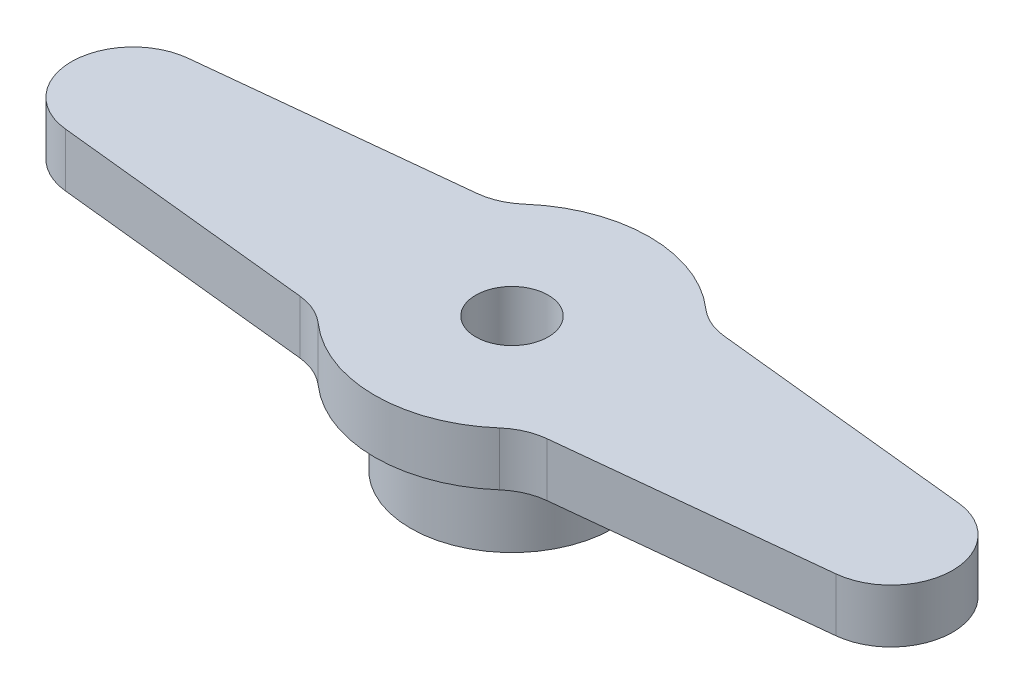
ISO-10303-21;
HEADER;
FILE_DESCRIPTION(('STEP AP214'),'2;1');
FILE_NAME('part.step','',(''),(''),'','','');
FILE_SCHEMA(('AUTOMOTIVE_DESIGN { 1 0 10303 214 1 1 1 1 }'));
ENDSEC;
DATA;
#1=APPLICATION_CONTEXT('core data for automotive mechanical design processes');
#2=APPLICATION_PROTOCOL_DEFINITION('international standard','automotive_design',2000,#1);
#3=PRODUCT_CONTEXT('',#1,'mechanical');
#4=PRODUCT('Part','Part','',(#3));
#5=PRODUCT_RELATED_PRODUCT_CATEGORY('part','',(#4));
#6=PRODUCT_DEFINITION_FORMATION('','',#4);
#7=PRODUCT_DEFINITION_CONTEXT('part definition',#1,'design');
#8=PRODUCT_DEFINITION('design','',#6,#7);
#9=PRODUCT_DEFINITION_SHAPE('','',#8);
#10=(LENGTH_UNIT() NAMED_UNIT(*) SI_UNIT(.MILLI.,.METRE.));
#11=(NAMED_UNIT(*) PLANE_ANGLE_UNIT() SI_UNIT($,.RADIAN.));
#12=(NAMED_UNIT(*) SI_UNIT($,.STERADIAN.) SOLID_ANGLE_UNIT());
#13=UNCERTAINTY_MEASURE_WITH_UNIT(LENGTH_MEASURE(1.E-05),#10,'distance_accuracy_value','');
#14=(GEOMETRIC_REPRESENTATION_CONTEXT(3) GLOBAL_UNCERTAINTY_ASSIGNED_CONTEXT((#13)) GLOBAL_UNIT_ASSIGNED_CONTEXT((#10,
#11,#12)) REPRESENTATION_CONTEXT('',''));
#15=CARTESIAN_POINT('',(0.,0.,0.));
#16=DIRECTION('',(0.,0.,1.));
#17=DIRECTION('',(1.,0.,0.));
#18=AXIS2_PLACEMENT_3D('',#15,#16,#17);
#19=CARTESIAN_POINT('',(0.,0.,0.));
#20=DIRECTION('',(0.,1.,0.));
#21=DIRECTION('',(0.,0.,1.));
#22=AXIS2_PLACEMENT_3D('',#19,#20,#21);
#23=PLANE('',#22);
#24=CARTESIAN_POINT('',(0.,0.,0.));
#25=DIRECTION('',(0.,1.,0.));
#26=DIRECTION('',(0.,0.,1.));
#27=AXIS2_PLACEMENT_3D('',#24,#25,#26);
#28=CIRCLE('',#27,4.3688);
#29=CARTESIAN_POINT('',(0.,0.,4.3688));
#30=VERTEX_POINT('',#29);
#31=EDGE_CURVE('E47',#30,#30,#28,.T.);
#32=ORIENTED_EDGE('',*,*,#31,.F.);
#33=EDGE_LOOP('',(#32));
#34=FACE_BOUND('',#33,.T.);
#35=CARTESIAN_POINT('',(0.,0.,0.));
#36=DIRECTION('',(0.,1.,0.));
#37=DIRECTION('',(0.,0.,1.));
#38=AXIS2_PLACEMENT_3D('',#35,#36,#37);
#39=CIRCLE('',#38,3.048);
#40=CARTESIAN_POINT('',(0.,0.,3.048));
#41=VERTEX_POINT('',#40);
#42=EDGE_CURVE('E247',#41,#41,#39,.T.);
#43=ORIENTED_EDGE('',*,*,#42,.T.);
#44=EDGE_LOOP('',(#43));
#45=FACE_BOUND('',#44,.T.);
#46=ADVANCED_FACE('F43',(#34,#45),#23,.F.);
#47=CARTESIAN_POINT('',(0.,3.429,0.));
#48=DIRECTION('',(0.,-1.,0.));
#49=DIRECTION('',(0.,0.,-1.));
#50=AXIS2_PLACEMENT_3D('',#47,#48,#49);
#51=CYLINDRICAL_SURFACE('',#50,4.3688);
#52=CARTESIAN_POINT('',(0.,3.429,0.));
#53=DIRECTION('',(0.,1.,0.));
#54=DIRECTION('',(0.,0.,1.));
#55=AXIS2_PLACEMENT_3D('',#52,#53,#54);
#56=CIRCLE('',#55,4.3688);
#57=CARTESIAN_POINT('',(0.,3.429,4.3688));
#58=VERTEX_POINT('',#57);
#59=EDGE_CURVE('E11',#58,#58,#56,.T.);
#60=ORIENTED_EDGE('',*,*,#59,.F.);
#61=EDGE_LOOP('',(#60));
#62=FACE_BOUND('',#61,.T.);
#63=ORIENTED_EDGE('',*,*,#31,.T.);
#64=EDGE_LOOP('',(#63));
#65=FACE_BOUND('',#64,.T.);
#66=ADVANCED_FACE('F45',(#62,#65),#51,.T.);
#67=CARTESIAN_POINT('',(0.,3.429,0.));
#68=DIRECTION('',(0.,-1.,0.));
#69=DIRECTION('',(0.,0.,-1.));
#70=AXIS2_PLACEMENT_3D('',#67,#68,#69);
#71=CYLINDRICAL_SURFACE('',#70,3.048);
#72=CARTESIAN_POINT('',(0.,3.429,0.));
#73=DIRECTION('',(0.,1.,0.));
#74=DIRECTION('',(0.,0.,1.));
#75=AXIS2_PLACEMENT_3D('',#72,#73,#74);
#76=CIRCLE('',#75,3.048);
#77=CARTESIAN_POINT('',(0.,3.429,3.048));
#78=VERTEX_POINT('',#77);
#79=EDGE_CURVE('E243',#78,#78,#76,.T.);
#80=ORIENTED_EDGE('',*,*,#79,.T.);
#81=EDGE_LOOP('',(#80));
#82=FACE_BOUND('',#81,.T.);
#83=ORIENTED_EDGE('',*,*,#42,.F.);
#84=EDGE_LOOP('',(#83));
#85=FACE_BOUND('',#84,.T.);
#86=ADVANCED_FACE('F261',(#82,#85),#71,.F.);
#87=CARTESIAN_POINT('',(16.3304426845668,3.429,0.));
#88=DIRECTION('',(0.,-1.,0.));
#89=DIRECTION('',(0.,0.,-1.));
#90=AXIS2_PLACEMENT_3D('',#87,#88,#89);
#91=PLANE('',#90);
#92=CARTESIAN_POINT('',(0.,3.429,0.));
#93=DIRECTION('',(0.,-1.,0.));
#94=DIRECTION('',(0.,0.,-1.));
#95=AXIS2_PLACEMENT_3D('',#92,#93,#94);
#96=CIRCLE('',#95,1.5621);
#97=CARTESIAN_POINT('',(0.,3.429,1.5621));
#98=VERTEX_POINT('',#97);
#99=EDGE_CURVE('E175',#98,#98,#96,.T.);
#100=ORIENTED_EDGE('',*,*,#99,.F.);
#101=EDGE_LOOP('',(#100));
#102=FACE_BOUND('',#101,.T.);
#103=ORIENTED_EDGE('',*,*,#79,.F.);
#104=EDGE_LOOP('',(#103));
#105=FACE_BOUND('',#104,.T.);
#106=ADVANCED_FACE('F266',(#102,#105),#91,.T.);
#107=CARTESIAN_POINT('',(16.3304426845668,5.7404,0.));
#108=DIRECTION('',(0.,-1.,0.));
#109=DIRECTION('',(0.,0.,-1.));
#110=AXIS2_PLACEMENT_3D('',#107,#108,#109);
#111=CYLINDRICAL_SURFACE('',#110,2.65605731543173);
#112=CARTESIAN_POINT('',(16.3304426845668,3.429,0.));
#113=DIRECTION('',(0.,1.,0.));
#114=DIRECTION('',(0.,0.,-1.));
#115=AXIS2_PLACEMENT_3D('',#112,#113,#114);
#116=CIRCLE('',#115,2.65605731543173);
#117=CARTESIAN_POINT('',(16.6071914927998,3.429,2.6416));
#118=VERTEX_POINT('',#117);
#119=CARTESIAN_POINT('',(16.6071914927998,3.429,-2.6416));
#120=VERTEX_POINT('',#119);
#121=EDGE_CURVE('E170',#118,#120,#116,.T.);
#122=ORIENTED_EDGE('',*,*,#121,.T.);
#123=DIRECTION('',(0.,-1.,0.));
#124=VECTOR('',#123,1.);
#125=CARTESIAN_POINT('',(16.6071914927998,5.7404,-2.6416));
#126=LINE('',#125,#124);
#127=CARTESIAN_POINT('',(16.6071914927998,5.7404,-2.6416));
#128=VERTEX_POINT('',#127);
#129=EDGE_CURVE('E240',#128,#120,#126,.T.);
#130=ORIENTED_EDGE('',*,*,#129,.F.);
#131=CARTESIAN_POINT('',(16.3304426845668,5.7404,0.));
#132=DIRECTION('',(0.,1.,0.));
#133=DIRECTION('',(0.,0.,-1.));
#134=AXIS2_PLACEMENT_3D('',#131,#132,#133);
#135=CIRCLE('',#134,2.65605731543173);
#136=CARTESIAN_POINT('',(16.6071914927998,5.7404,2.6416));
#137=VERTEX_POINT('',#136);
#138=EDGE_CURVE('E205',#137,#128,#135,.T.);
#139=ORIENTED_EDGE('',*,*,#138,.F.);
#140=DIRECTION('',(0.,-1.,0.));
#141=VECTOR('',#140,1.);
#142=CARTESIAN_POINT('',(16.6071914927998,5.7404,2.6416));
#143=LINE('',#142,#141);
#144=EDGE_CURVE('E166',#137,#118,#143,.T.);
#145=ORIENTED_EDGE('',*,*,#144,.T.);
#146=EDGE_LOOP('',(#122,#130,#139,#145));
#147=FACE_BOUND('',#146,.T.);
#148=ADVANCED_FACE('F268',(#147),#111,.T.);
#149=CARTESIAN_POINT('',(5.32270878770068,5.7404,-3.82382559818391));
#150=DIRECTION('',(-0.104195344966817,0.,0.994556851108697));
#151=DIRECTION('',(0.994556851108697,0.,0.104195344966817));
#152=AXIS2_PLACEMENT_3D('',#149,#150,#151);
#153=PLANE('',#152);
#154=DIRECTION('',(-0.994556851108697,0.,-0.104195344966817));
#155=VECTOR('',#154,1.);
#156=CARTESIAN_POINT('',(5.32270878770068,3.429,-3.82382559818391));
#157=LINE('',#156,#155);
#158=CARTESIAN_POINT('',(5.32270878770068,3.429,-3.82382559818391));
#159=VERTEX_POINT('',#158);
#160=EDGE_CURVE('E174',#120,#159,#157,.T.);
#161=ORIENTED_EDGE('',*,*,#160,.T.);
#162=DIRECTION('',(0.,-1.,0.));
#163=VECTOR('',#162,1.);
#164=CARTESIAN_POINT('',(5.32270878770068,5.7404,-3.82382559818391));
#165=LINE('',#164,#163);
#166=CARTESIAN_POINT('',(5.32270878770068,5.7404,-3.82382559818391));
#167=VERTEX_POINT('',#166);
#168=EDGE_CURVE('E236',#167,#159,#165,.T.);
#169=ORIENTED_EDGE('',*,*,#168,.F.);
#170=DIRECTION('',(-0.994556851108697,0.,-0.104195344966817));
#171=VECTOR('',#170,1.);
#172=CARTESIAN_POINT('',(5.32270878770068,5.7404,-3.82382559818391));
#173=LINE('',#172,#171);
#174=EDGE_CURVE('E117',#128,#167,#173,.T.);
#175=ORIENTED_EDGE('',*,*,#174,.F.);
#176=ORIENTED_EDGE('',*,*,#129,.T.);
#177=EDGE_LOOP('',(#161,#169,#175,#176));
#178=FACE_BOUND('',#177,.T.);
#179=ADVANCED_FACE('F271',(#178),#153,.F.);
#180=CARTESIAN_POINT('',(5.58736496391636,5.7404,-6.35));
#181=DIRECTION('',(0.,-1.,0.));
#182=DIRECTION('',(0.,0.,-1.));
#183=AXIS2_PLACEMENT_3D('',#180,#181,#182);
#184=CYLINDRICAL_SURFACE('',#183,2.54);
#185=CARTESIAN_POINT('',(5.58736496391636,3.429,-6.35));
#186=DIRECTION('',(0.,-1.,0.));
#187=DIRECTION('',(0.,0.,-1.));
#188=AXIS2_PLACEMENT_3D('',#185,#186,#187);
#189=CIRCLE('',#188,2.54);
#190=CARTESIAN_POINT('',(3.9094775873649,3.429,-4.44309309309309));
#191=VERTEX_POINT('',#190);
#192=EDGE_CURVE('E178',#159,#191,#189,.T.);
#193=ORIENTED_EDGE('',*,*,#192,.T.);
#194=DIRECTION('',(0.,-1.,0.));
#195=VECTOR('',#194,1.);
#196=CARTESIAN_POINT('',(3.9094775873649,5.7404,-4.44309309309309));
#197=LINE('',#196,#195);
#198=CARTESIAN_POINT('',(3.9094775873649,5.7404,-4.44309309309309));
#199=VERTEX_POINT('',#198);
#200=EDGE_CURVE('E232',#199,#191,#197,.T.);
#201=ORIENTED_EDGE('',*,*,#200,.F.);
#202=CARTESIAN_POINT('',(5.58736496391636,5.7404,-6.35));
#203=DIRECTION('',(0.,-1.,0.));
#204=DIRECTION('',(0.,0.,-1.));
#205=AXIS2_PLACEMENT_3D('',#202,#203,#204);
#206=CIRCLE('',#205,2.54);
#207=EDGE_CURVE('E337',#167,#199,#206,.T.);
#208=ORIENTED_EDGE('',*,*,#207,.F.);
#209=ORIENTED_EDGE('',*,*,#168,.T.);
#210=EDGE_LOOP('',(#193,#201,#208,#209));
#211=FACE_BOUND('',#210,.T.);
#212=ADVANCED_FACE('F275',(#211),#184,.F.);
#213=CARTESIAN_POINT('',(0.,5.7404,0.));
#214=DIRECTION('',(0.,-1.,0.));
#215=DIRECTION('',(0.,0.,-1.));
#216=AXIS2_PLACEMENT_3D('',#213,#214,#215);
#217=CYLINDRICAL_SURFACE('',#216,5.9182);
#218=CARTESIAN_POINT('',(0.,3.429,0.));
#219=DIRECTION('',(0.,1.,0.));
#220=DIRECTION('',(0.,0.,1.));
#221=AXIS2_PLACEMENT_3D('',#218,#219,#220);
#222=CIRCLE('',#221,5.9182);
#223=CARTESIAN_POINT('',(-3.9094775873649,3.429,-4.44309309309309));
#224=VERTEX_POINT('',#223);
#225=EDGE_CURVE('E181',#191,#224,#222,.T.);
#226=ORIENTED_EDGE('',*,*,#225,.T.);
#227=DIRECTION('',(0.,-1.,0.));
#228=VECTOR('',#227,1.);
#229=CARTESIAN_POINT('',(-3.9094775873649,5.7404,-4.44309309309309));
#230=LINE('',#229,#228);
#231=CARTESIAN_POINT('',(-3.9094775873649,5.7404,-4.44309309309309));
#232=VERTEX_POINT('',#231);
#233=EDGE_CURVE('E228',#232,#224,#230,.T.);
#234=ORIENTED_EDGE('',*,*,#233,.F.);
#235=CARTESIAN_POINT('',(0.,5.7404,0.));
#236=DIRECTION('',(0.,1.,0.));
#237=DIRECTION('',(0.,0.,1.));
#238=AXIS2_PLACEMENT_3D('',#235,#236,#237);
#239=CIRCLE('',#238,5.9182);
#240=EDGE_CURVE('E340',#199,#232,#239,.T.);
#241=ORIENTED_EDGE('',*,*,#240,.F.);
#242=ORIENTED_EDGE('',*,*,#200,.T.);
#243=EDGE_LOOP('',(#226,#234,#241,#242));
#244=FACE_BOUND('',#243,.T.);
#245=ADVANCED_FACE('F278',(#244),#217,.T.);
#246=CARTESIAN_POINT('',(-5.58736496391636,5.7404,-6.35));
#247=DIRECTION('',(0.,-1.,0.));
#248=DIRECTION('',(0.,0.,-1.));
#249=AXIS2_PLACEMENT_3D('',#246,#247,#248);
#250=CYLINDRICAL_SURFACE('',#249,2.54);
#251=CARTESIAN_POINT('',(-5.58736496391636,3.429,-6.35));
#252=DIRECTION('',(0.,-1.,0.));
#253=DIRECTION('',(0.,0.,1.));
#254=AXIS2_PLACEMENT_3D('',#251,#252,#253);
#255=CIRCLE('',#254,2.54);
#256=CARTESIAN_POINT('',(-5.32270878770068,3.429,-3.82382559818391));
#257=VERTEX_POINT('',#256);
#258=EDGE_CURVE('E184',#224,#257,#255,.T.);
#259=ORIENTED_EDGE('',*,*,#258,.T.);
#260=DIRECTION('',(0.,-1.,0.));
#261=VECTOR('',#260,1.);
#262=CARTESIAN_POINT('',(-5.32270878770068,5.7404,-3.82382559818391));
#263=LINE('',#262,#261);
#264=CARTESIAN_POINT('',(-5.32270878770068,5.7404,-3.82382559818391));
#265=VERTEX_POINT('',#264);
#266=EDGE_CURVE('E224',#265,#257,#263,.T.);
#267=ORIENTED_EDGE('',*,*,#266,.F.);
#268=CARTESIAN_POINT('',(-5.58736496391636,5.7404,-6.35));
#269=DIRECTION('',(0.,-1.,0.));
#270=DIRECTION('',(0.,0.,1.));
#271=AXIS2_PLACEMENT_3D('',#268,#269,#270);
#272=CIRCLE('',#271,2.54);
#273=EDGE_CURVE('E343',#232,#265,#272,.T.);
#274=ORIENTED_EDGE('',*,*,#273,.F.);
#275=ORIENTED_EDGE('',*,*,#233,.T.);
#276=EDGE_LOOP('',(#259,#267,#274,#275));
#277=FACE_BOUND('',#276,.T.);
#278=ADVANCED_FACE('F282',(#277),#250,.F.);
#279=CARTESIAN_POINT('',(-5.32270878770068,5.7404,-3.82382559818391));
#280=DIRECTION('',(0.104195344966817,0.,0.994556851108697));
#281=DIRECTION('',(0.994556851108697,0.,-0.104195344966817));
#282=AXIS2_PLACEMENT_3D('',#279,#280,#281);
#283=PLANE('',#282);
#284=DIRECTION('',(-0.994556851108697,0.,0.104195344966817));
#285=VECTOR('',#284,1.);
#286=CARTESIAN_POINT('',(-5.32270878770068,3.429,-3.82382559818391));
#287=LINE('',#286,#285);
#288=CARTESIAN_POINT('',(-16.6071914927998,3.429,-2.6416));
#289=VERTEX_POINT('',#288);
#290=EDGE_CURVE('E187',#257,#289,#287,.T.);
#291=ORIENTED_EDGE('',*,*,#290,.T.);
#292=DIRECTION('',(0.,-1.,0.));
#293=VECTOR('',#292,1.);
#294=CARTESIAN_POINT('',(-16.6071914927998,5.7404,-2.6416));
#295=LINE('',#294,#293);
#296=CARTESIAN_POINT('',(-16.6071914927998,5.7404,-2.6416));
#297=VERTEX_POINT('',#296);
#298=EDGE_CURVE('E220',#297,#289,#295,.T.);
#299=ORIENTED_EDGE('',*,*,#298,.F.);
#300=DIRECTION('',(-0.994556851108697,0.,0.104195344966817));
#301=VECTOR('',#300,1.);
#302=CARTESIAN_POINT('',(-5.32270878770068,5.7404,-3.82382559818391));
#303=LINE('',#302,#301);
#304=EDGE_CURVE('E346',#265,#297,#303,.T.);
#305=ORIENTED_EDGE('',*,*,#304,.F.);
#306=ORIENTED_EDGE('',*,*,#266,.T.);
#307=EDGE_LOOP('',(#291,#299,#305,#306));
#308=FACE_BOUND('',#307,.T.);
#309=ADVANCED_FACE('F286',(#308),#283,.F.);
#310=CARTESIAN_POINT('',(-16.3304426845668,5.7404,0.));
#311=DIRECTION('',(0.,-1.,0.));
#312=DIRECTION('',(0.,0.,-1.));
#313=AXIS2_PLACEMENT_3D('',#310,#311,#312);
#314=CYLINDRICAL_SURFACE('',#313,2.65605731543173);
#315=CARTESIAN_POINT('',(-16.3304426845668,3.429,0.));
#316=DIRECTION('',(0.,1.,0.));
#317=DIRECTION('',(0.,0.,1.));
#318=AXIS2_PLACEMENT_3D('',#315,#316,#317);
#319=CIRCLE('',#318,2.65605731543173);
#320=CARTESIAN_POINT('',(-16.6071914927998,3.429,2.6416));
#321=VERTEX_POINT('',#320);
#322=EDGE_CURVE('E190',#289,#321,#319,.T.);
#323=ORIENTED_EDGE('',*,*,#322,.T.);
#324=DIRECTION('',(0.,-1.,0.));
#325=VECTOR('',#324,1.);
#326=CARTESIAN_POINT('',(-16.6071914927998,5.7404,2.6416));
#327=LINE('',#326,#325);
#328=CARTESIAN_POINT('',(-16.6071914927998,5.7404,2.6416));
#329=VERTEX_POINT('',#328);
#330=EDGE_CURVE('E216',#329,#321,#327,.T.);
#331=ORIENTED_EDGE('',*,*,#330,.F.);
#332=CARTESIAN_POINT('',(-16.3304426845668,5.7404,0.));
#333=DIRECTION('',(0.,1.,0.));
#334=DIRECTION('',(0.,0.,1.));
#335=AXIS2_PLACEMENT_3D('',#332,#333,#334);
#336=CIRCLE('',#335,2.65605731543173);
#337=EDGE_CURVE('E349',#297,#329,#336,.T.);
#338=ORIENTED_EDGE('',*,*,#337,.F.);
#339=ORIENTED_EDGE('',*,*,#298,.T.);
#340=EDGE_LOOP('',(#323,#331,#338,#339));
#341=FACE_BOUND('',#340,.T.);
#342=ADVANCED_FACE('F290',(#341),#314,.T.);
#343=CARTESIAN_POINT('',(-5.32270878770068,5.7404,3.82382559818391));
#344=DIRECTION('',(0.104195344966817,0.,-0.994556851108697));
#345=DIRECTION('',(-0.994556851108697,0.,-0.104195344966817));
#346=AXIS2_PLACEMENT_3D('',#343,#344,#345);
#347=PLANE('',#346);
#348=DIRECTION('',(0.994556851108697,0.,0.104195344966817));
#349=VECTOR('',#348,1.);
#350=CARTESIAN_POINT('',(-5.32270878770068,3.429,3.82382559818391));
#351=LINE('',#350,#349);
#352=CARTESIAN_POINT('',(-5.32270878770068,3.429,3.82382559818391));
#353=VERTEX_POINT('',#352);
#354=EDGE_CURVE('E193',#321,#353,#351,.T.);
#355=ORIENTED_EDGE('',*,*,#354,.T.);
#356=DIRECTION('',(0.,-1.,0.));
#357=VECTOR('',#356,1.);
#358=CARTESIAN_POINT('',(-5.32270878770068,5.7404,3.82382559818391));
#359=LINE('',#358,#357);
#360=CARTESIAN_POINT('',(-5.32270878770068,5.7404,3.82382559818391));
#361=VERTEX_POINT('',#360);
#362=EDGE_CURVE('E212',#361,#353,#359,.T.);
#363=ORIENTED_EDGE('',*,*,#362,.F.);
#364=DIRECTION('',(0.994556851108697,0.,0.104195344966817));
#365=VECTOR('',#364,1.);
#366=CARTESIAN_POINT('',(-5.32270878770068,5.7404,3.82382559818391));
#367=LINE('',#366,#365);
#368=EDGE_CURVE('E352',#329,#361,#367,.T.);
#369=ORIENTED_EDGE('',*,*,#368,.F.);
#370=ORIENTED_EDGE('',*,*,#330,.T.);
#371=EDGE_LOOP('',(#355,#363,#369,#370));
#372=FACE_BOUND('',#371,.T.);
#373=ADVANCED_FACE('F294',(#372),#347,.F.);
#374=CARTESIAN_POINT('',(-5.58736496391636,5.7404,6.35));
#375=DIRECTION('',(0.,-1.,0.));
#376=DIRECTION('',(0.,0.,-1.));
#377=AXIS2_PLACEMENT_3D('',#374,#375,#376);
#378=CYLINDRICAL_SURFACE('',#377,2.54);
#379=CARTESIAN_POINT('',(-5.58736496391636,3.429,6.35));
#380=DIRECTION('',(0.,-1.,0.));
#381=DIRECTION('',(0.,0.,-1.));
#382=AXIS2_PLACEMENT_3D('',#379,#380,#381);
#383=CIRCLE('',#382,2.54);
#384=CARTESIAN_POINT('',(-3.9094775873649,3.429,4.44309309309309));
#385=VERTEX_POINT('',#384);
#386=EDGE_CURVE('E196',#353,#385,#383,.T.);
#387=ORIENTED_EDGE('',*,*,#386,.T.);
#388=DIRECTION('',(0.,-1.,0.));
#389=VECTOR('',#388,1.);
#390=CARTESIAN_POINT('',(-3.9094775873649,5.7404,4.44309309309309));
#391=LINE('',#390,#389);
#392=CARTESIAN_POINT('',(-3.9094775873649,5.7404,4.44309309309309));
#393=VERTEX_POINT('',#392);
#394=EDGE_CURVE('E159',#393,#385,#391,.T.);
#395=ORIENTED_EDGE('',*,*,#394,.F.);
#396=CARTESIAN_POINT('',(-5.58736496391636,5.7404,6.35));
#397=DIRECTION('',(0.,-1.,0.));
#398=DIRECTION('',(0.,0.,-1.));
#399=AXIS2_PLACEMENT_3D('',#396,#397,#398);
#400=CIRCLE('',#399,2.54);
#401=EDGE_CURVE('E148',#361,#393,#400,.T.);
#402=ORIENTED_EDGE('',*,*,#401,.F.);
#403=ORIENTED_EDGE('',*,*,#362,.T.);
#404=EDGE_LOOP('',(#387,#395,#402,#403));
#405=FACE_BOUND('',#404,.T.);
#406=ADVANCED_FACE('F298',(#405),#378,.F.);
#407=CARTESIAN_POINT('',(0.,5.7404,0.));
#408=DIRECTION('',(0.,-1.,0.));
#409=DIRECTION('',(0.,0.,-1.));
#410=AXIS2_PLACEMENT_3D('',#407,#408,#409);
#411=CYLINDRICAL_SURFACE('',#410,5.9182);
#412=CARTESIAN_POINT('',(0.,3.429,0.));
#413=DIRECTION('',(0.,1.,0.));
#414=DIRECTION('',(0.,0.,1.));
#415=AXIS2_PLACEMENT_3D('',#412,#413,#414);
#416=CIRCLE('',#415,5.9182);
#417=CARTESIAN_POINT('',(3.9094775873649,3.429,4.44309309309309));
#418=VERTEX_POINT('',#417);
#419=EDGE_CURVE('E157',#385,#418,#416,.T.);
#420=ORIENTED_EDGE('',*,*,#419,.T.);
#421=DIRECTION('',(0.,-1.,0.));
#422=VECTOR('',#421,1.);
#423=CARTESIAN_POINT('',(3.9094775873649,5.7404,4.44309309309309));
#424=LINE('',#423,#422);
#425=CARTESIAN_POINT('',(3.9094775873649,5.7404,4.44309309309309));
#426=VERTEX_POINT('',#425);
#427=EDGE_CURVE('E154',#426,#418,#424,.T.);
#428=ORIENTED_EDGE('',*,*,#427,.F.);
#429=CARTESIAN_POINT('',(0.,5.7404,0.));
#430=DIRECTION('',(0.,1.,0.));
#431=DIRECTION('',(0.,0.,1.));
#432=AXIS2_PLACEMENT_3D('',#429,#430,#431);
#433=CIRCLE('',#432,5.9182);
#434=EDGE_CURVE('E142',#393,#426,#433,.T.);
#435=ORIENTED_EDGE('',*,*,#434,.F.);
#436=ORIENTED_EDGE('',*,*,#394,.T.);
#437=EDGE_LOOP('',(#420,#428,#435,#436));
#438=FACE_BOUND('',#437,.T.);
#439=ADVANCED_FACE('F155',(#438),#411,.T.);
#440=CARTESIAN_POINT('',(5.58736496391636,5.7404,6.35));
#441=DIRECTION('',(0.,-1.,0.));
#442=DIRECTION('',(0.,0.,-1.));
#443=AXIS2_PLACEMENT_3D('',#440,#441,#442);
#444=CYLINDRICAL_SURFACE('',#443,2.54);
#445=CARTESIAN_POINT('',(5.58736496391636,3.429,6.35));
#446=DIRECTION('',(0.,-1.,0.));
#447=DIRECTION('',(0.,0.,1.));
#448=AXIS2_PLACEMENT_3D('',#445,#446,#447);
#449=CIRCLE('',#448,2.54);
#450=CARTESIAN_POINT('',(5.32270878770068,3.429,3.82382559818391));
#451=VERTEX_POINT('',#450);
#452=EDGE_CURVE('E102',#418,#451,#449,.T.);
#453=ORIENTED_EDGE('',*,*,#452,.T.);
#454=DIRECTION('',(0.,-1.,0.));
#455=VECTOR('',#454,1.);
#456=CARTESIAN_POINT('',(5.32270878770068,5.7404,3.82382559818391));
#457=LINE('',#456,#455);
#458=CARTESIAN_POINT('',(5.32270878770068,5.7404,3.82382559818391));
#459=VERTEX_POINT('',#458);
#460=EDGE_CURVE('E160',#459,#451,#457,.T.);
#461=ORIENTED_EDGE('',*,*,#460,.F.);
#462=CARTESIAN_POINT('',(5.58736496391636,5.7404,6.35));
#463=DIRECTION('',(0.,-1.,0.));
#464=DIRECTION('',(0.,0.,1.));
#465=AXIS2_PLACEMENT_3D('',#462,#463,#464);
#466=CIRCLE('',#465,2.54);
#467=EDGE_CURVE('E146',#426,#459,#466,.T.);
#468=ORIENTED_EDGE('',*,*,#467,.F.);
#469=ORIENTED_EDGE('',*,*,#427,.T.);
#470=EDGE_LOOP('',(#453,#461,#468,#469));
#471=FACE_BOUND('',#470,.T.);
#472=ADVANCED_FACE('F162',(#471),#444,.F.);
#473=CARTESIAN_POINT('',(5.32270878770068,5.7404,3.82382559818391));
#474=DIRECTION('',(-0.104195344966817,0.,-0.994556851108697));
#475=DIRECTION('',(-0.994556851108697,0.,0.104195344966817));
#476=AXIS2_PLACEMENT_3D('',#473,#474,#475);
#477=PLANE('',#476);
#478=DIRECTION('',(0.994556851108697,0.,-0.104195344966817));
#479=VECTOR('',#478,1.);
#480=CARTESIAN_POINT('',(5.32270878770068,3.429,3.82382559818391));
#481=LINE('',#480,#479);
#482=EDGE_CURVE('E108',#451,#118,#481,.T.);
#483=ORIENTED_EDGE('',*,*,#482,.T.);
#484=ORIENTED_EDGE('',*,*,#144,.F.);
#485=DIRECTION('',(0.994556851108697,0.,-0.104195344966817));
#486=VECTOR('',#485,1.);
#487=CARTESIAN_POINT('',(5.32270878770068,5.7404,3.82382559818391));
#488=LINE('',#487,#486);
#489=EDGE_CURVE('E61',#459,#137,#488,.T.);
#490=ORIENTED_EDGE('',*,*,#489,.F.);
#491=ORIENTED_EDGE('',*,*,#460,.T.);
#492=EDGE_LOOP('',(#483,#484,#490,#491));
#493=FACE_BOUND('',#492,.T.);
#494=ADVANCED_FACE('F307',(#493),#477,.F.);
#495=CARTESIAN_POINT('',(16.3304426845668,5.7404,0.));
#496=DIRECTION('',(0.,-1.,0.));
#497=DIRECTION('',(0.,0.,-1.));
#498=AXIS2_PLACEMENT_3D('',#495,#496,#497);
#499=PLANE('',#498);
#500=CARTESIAN_POINT('',(0.,5.7404,0.));
#501=DIRECTION('',(0.,1.,0.));
#502=DIRECTION('',(0.,0.,1.));
#503=AXIS2_PLACEMENT_3D('',#500,#501,#502);
#504=CIRCLE('',#503,1.5621);
#505=CARTESIAN_POINT('',(0.,5.7404,1.5621));
#506=VERTEX_POINT('',#505);
#507=EDGE_CURVE('E327',#506,#506,#504,.T.);
#508=ORIENTED_EDGE('',*,*,#507,.F.);
#509=EDGE_LOOP('',(#508));
#510=FACE_BOUND('',#509,.T.);
#511=ORIENTED_EDGE('',*,*,#138,.T.);
#512=ORIENTED_EDGE('',*,*,#174,.T.);
#513=ORIENTED_EDGE('',*,*,#207,.T.);
#514=ORIENTED_EDGE('',*,*,#240,.T.);
#515=ORIENTED_EDGE('',*,*,#273,.T.);
#516=ORIENTED_EDGE('',*,*,#304,.T.);
#517=ORIENTED_EDGE('',*,*,#337,.T.);
#518=ORIENTED_EDGE('',*,*,#368,.T.);
#519=ORIENTED_EDGE('',*,*,#401,.T.);
#520=ORIENTED_EDGE('',*,*,#434,.T.);
#521=ORIENTED_EDGE('',*,*,#467,.T.);
#522=ORIENTED_EDGE('',*,*,#489,.T.);
#523=EDGE_LOOP('',(#511,#512,#513,#514,#515,#516,#517,#518,#519,#520,#521,#522));
#524=FACE_BOUND('',#523,.T.);
#525=ADVANCED_FACE('F144',(#510,#524),#499,.F.);
#526=ORIENTED_EDGE('',*,*,#59,.T.);
#527=EDGE_LOOP('',(#526));
#528=FACE_BOUND('',#527,.T.);
#529=ORIENTED_EDGE('',*,*,#121,.F.);
#530=ORIENTED_EDGE('',*,*,#482,.F.);
#531=ORIENTED_EDGE('',*,*,#452,.F.);
#532=ORIENTED_EDGE('',*,*,#419,.F.);
#533=ORIENTED_EDGE('',*,*,#386,.F.);
#534=ORIENTED_EDGE('',*,*,#354,.F.);
#535=ORIENTED_EDGE('',*,*,#322,.F.);
#536=ORIENTED_EDGE('',*,*,#290,.F.);
#537=ORIENTED_EDGE('',*,*,#258,.F.);
#538=ORIENTED_EDGE('',*,*,#225,.F.);
#539=ORIENTED_EDGE('',*,*,#192,.F.);
#540=ORIENTED_EDGE('',*,*,#160,.F.);
#541=EDGE_LOOP('',(#529,#530,#531,#532,#533,#534,#535,#536,#537,#538,#539,#540));
#542=FACE_BOUND('',#541,.T.);
#543=ADVANCED_FACE('F310',(#528,#542),#91,.T.);
#544=CARTESIAN_POINT('',(0.,0.,0.));
#545=DIRECTION('',(0.,1.,0.));
#546=DIRECTION('',(0.,0.,1.));
#547=AXIS2_PLACEMENT_3D('',#544,#545,#546);
#548=CYLINDRICAL_SURFACE('',#547,1.5621);
#549=CARTESIAN_POINT('',(0.,3.429,1.5621));
#550=CARTESIAN_POINT('',(0.,3.45307708333333,1.5621));
#551=CARTESIAN_POINT('',(0.,3.47715416666667,1.5621));
#552=CARTESIAN_POINT('',(0.,3.52530833333333,1.5621));
#553=CARTESIAN_POINT('',(0.,3.54938541666667,1.5621));
#554=CARTESIAN_POINT('',(0.,3.59753958333333,1.5621));
#555=CARTESIAN_POINT('',(0.,3.62161666666667,1.5621));
#556=CARTESIAN_POINT('',(0.,3.66977083333333,1.5621));
#557=CARTESIAN_POINT('',(0.,3.69384791666667,1.5621));
#558=CARTESIAN_POINT('',(0.,3.74200208333333,1.5621));
#559=CARTESIAN_POINT('',(0.,3.76607916666667,1.5621));
#560=CARTESIAN_POINT('',(0.,3.81423333333333,1.5621));
#561=CARTESIAN_POINT('',(0.,3.83831041666667,1.5621));
#562=CARTESIAN_POINT('',(0.,3.88646458333333,1.5621));
#563=CARTESIAN_POINT('',(0.,3.91054166666667,1.5621));
#564=CARTESIAN_POINT('',(0.,3.95869583333333,1.5621));
#565=CARTESIAN_POINT('',(0.,3.98277291666667,1.5621));
#566=CARTESIAN_POINT('',(0.,4.03092708333333,1.5621));
#567=CARTESIAN_POINT('',(0.,4.05500416666667,1.5621));
#568=CARTESIAN_POINT('',(0.,4.10315833333333,1.5621));
#569=CARTESIAN_POINT('',(0.,4.12723541666667,1.5621));
#570=CARTESIAN_POINT('',(0.,4.17538958333333,1.5621));
#571=CARTESIAN_POINT('',(0.,4.19946666666667,1.5621));
#572=CARTESIAN_POINT('',(0.,4.24762083333333,1.5621));
#573=CARTESIAN_POINT('',(0.,4.27169791666667,1.5621));
#574=CARTESIAN_POINT('',(0.,4.31985208333333,1.5621));
#575=CARTESIAN_POINT('',(0.,4.34392916666667,1.5621));
#576=CARTESIAN_POINT('',(0.,4.39208333333333,1.5621));
#577=CARTESIAN_POINT('',(0.,4.41616041666667,1.5621));
#578=CARTESIAN_POINT('',(0.,4.46431458333333,1.5621));
#579=CARTESIAN_POINT('',(0.,4.48839166666667,1.5621));
#580=CARTESIAN_POINT('',(0.,4.53654583333333,1.5621));
#581=CARTESIAN_POINT('',(0.,4.56062291666667,1.5621));
#582=CARTESIAN_POINT('',(0.,4.60877708333333,1.5621));
#583=CARTESIAN_POINT('',(0.,4.63285416666667,1.5621));
#584=CARTESIAN_POINT('',(0.,4.68100833333333,1.5621));
#585=CARTESIAN_POINT('',(0.,4.70508541666667,1.5621));
#586=CARTESIAN_POINT('',(0.,4.75323958333333,1.5621));
#587=CARTESIAN_POINT('',(0.,4.77731666666667,1.5621));
#588=CARTESIAN_POINT('',(0.,4.82547083333333,1.5621));
#589=CARTESIAN_POINT('',(0.,4.84954791666667,1.5621));
#590=CARTESIAN_POINT('',(0.,4.89770208333333,1.5621));
#591=CARTESIAN_POINT('',(0.,4.92177916666667,1.5621));
#592=CARTESIAN_POINT('',(0.,4.96993333333333,1.5621));
#593=CARTESIAN_POINT('',(0.,4.99401041666667,1.5621));
#594=CARTESIAN_POINT('',(0.,5.04216458333333,1.5621));
#595=CARTESIAN_POINT('',(0.,5.06624166666667,1.5621));
#596=CARTESIAN_POINT('',(0.,5.11439583333333,1.5621));
#597=CARTESIAN_POINT('',(0.,5.13847291666667,1.5621));
#598=CARTESIAN_POINT('',(0.,5.18662708333333,1.5621));
#599=CARTESIAN_POINT('',(0.,5.21070416666667,1.5621));
#600=CARTESIAN_POINT('',(0.,5.25885833333333,1.5621));
#601=CARTESIAN_POINT('',(0.,5.28293541666667,1.5621));
#602=CARTESIAN_POINT('',(0.,5.33108958333333,1.5621));
#603=CARTESIAN_POINT('',(0.,5.35516666666667,1.5621));
#604=CARTESIAN_POINT('',(0.,5.40332083333333,1.5621));
#605=CARTESIAN_POINT('',(0.,5.42739791666667,1.5621));
#606=CARTESIAN_POINT('',(0.,5.47555208333333,1.5621));
#607=CARTESIAN_POINT('',(0.,5.49962916666667,1.5621));
#608=CARTESIAN_POINT('',(0.,5.54778333333333,1.5621));
#609=CARTESIAN_POINT('',(0.,5.57186041666667,1.5621));
#610=CARTESIAN_POINT('',(0.,5.62001458333333,1.5621));
#611=CARTESIAN_POINT('',(0.,5.64409166666667,1.5621));
#612=CARTESIAN_POINT('',(0.,5.69224583333333,1.5621));
#613=CARTESIAN_POINT('',(0.,5.71632291666667,1.5621));
#614=CARTESIAN_POINT('',(0.,5.7404,1.5621));
#615=B_SPLINE_CURVE_WITH_KNOTS('',3,(#549,#550,#551,#552,#553,#554,#555,#556,#557,#558,#559,
#560,#561,#562,#563,#564,#565,#566,#567,#568,#569,#570,#571,#572,#573,#574,#575,#576,#577,#578,
#579,#580,#581,#582,#583,#584,#585,#586,#587,#588,#589,#590,#591,#592,#593,#594,#595,#596,#597,
#598,#599,#600,#601,#602,#603,#604,#605,#606,#607,#608,#609,#610,#611,#612,#613,#614),
.UNSPECIFIED.,.F.,.F.,(4,2,2,2,2,2,2,2,2,2,2,2,2,2,2,2,2,2,2,2,2,2,2,2,2,2,2,2,2,2,2,2,4),(0.,
0.0722312500000002,0.1444625,0.21669375,0.288925,0.36115625,0.4333875,0.505618749999999,
0.577849999999999,0.650081249999999,0.722312499999999,0.794543749999999,0.866774999999999,
0.939006249999999,1.0112375,1.08346875,1.1557,1.22793125,1.3001625,1.37239375,1.444625,
1.51685625,1.5890875,1.66131875,1.73355,1.80578125,1.8780125,1.95024375,2.022475,2.09470625,
2.1669375,2.23916875,2.3114),.UNSPECIFIED.);
#616=EDGE_CURVE('BSEAM313',#98,#506,#615,.T.);
#617=ORIENTED_EDGE('',*,*,#99,.T.);
#618=ORIENTED_EDGE('',*,*,#507,.T.);
#619=ORIENTED_EDGE('',*,*,#616,.T.);
#620=ORIENTED_EDGE('',*,*,#616,.F.);
#621=EDGE_LOOP('',(#617,#619,#618,#620));
#622=FACE_BOUND('',#621,.T.);
#623=ADVANCED_FACE('F313',(#622),#548,.F.);
#624=CLOSED_SHELL('',(#46,#66,#86,#106,#148,#179,#212,#245,#278,#309,#342,#373,#406,#439,#472,
#494,#525,#543,#623));
#625=MANIFOLD_SOLID_BREP('B2',#624);
#626=ADVANCED_BREP_SHAPE_REPRESENTATION('',(#18,#625),#14);
#627=SHAPE_DEFINITION_REPRESENTATION(#9,#626);
ENDSEC;
END-ISO-10303-21;
